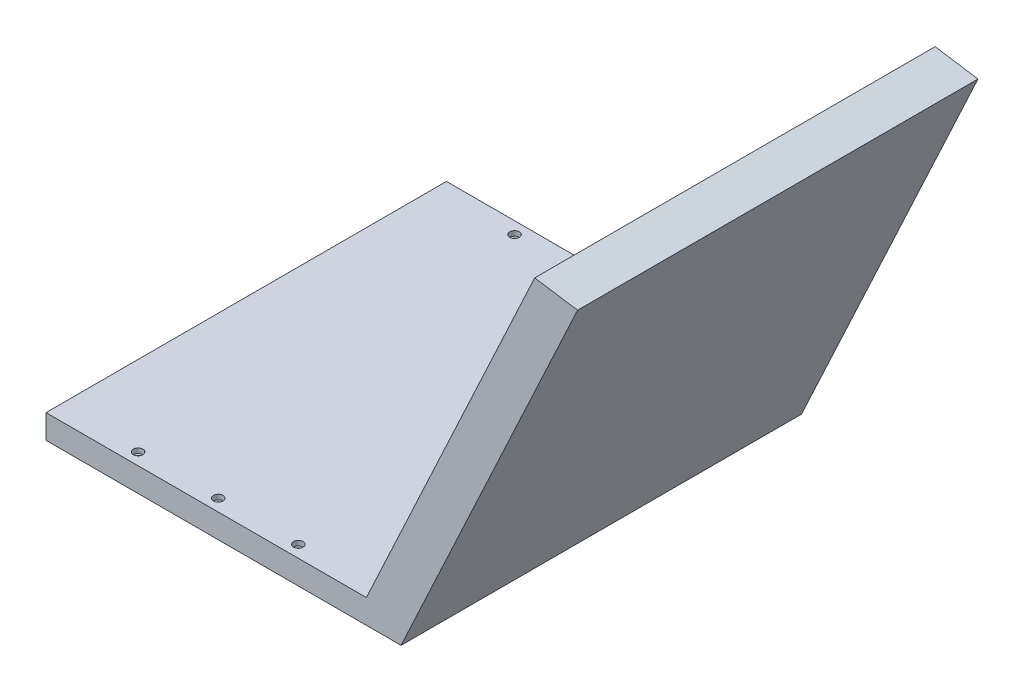
ISO-10303-21;
HEADER;
FILE_DESCRIPTION(('STEP AP214'),'2;1');
FILE_NAME('part.step','',(''),(''),'','','');
FILE_SCHEMA(('AUTOMOTIVE_DESIGN { 1 0 10303 214 1 1 1 1 }'));
ENDSEC;
DATA;
#1=APPLICATION_CONTEXT('core data for automotive mechanical design processes');
#2=APPLICATION_PROTOCOL_DEFINITION('international standard','automotive_design',2000,#1);
#3=PRODUCT_CONTEXT('',#1,'mechanical');
#4=PRODUCT('Part','Part','',(#3));
#5=PRODUCT_RELATED_PRODUCT_CATEGORY('part','',(#4));
#6=PRODUCT_DEFINITION_FORMATION('','',#4);
#7=PRODUCT_DEFINITION_CONTEXT('part definition',#1,'design');
#8=PRODUCT_DEFINITION('design','',#6,#7);
#9=PRODUCT_DEFINITION_SHAPE('','',#8);
#10=(LENGTH_UNIT() NAMED_UNIT(*) SI_UNIT(.MILLI.,.METRE.));
#11=(NAMED_UNIT(*) PLANE_ANGLE_UNIT() SI_UNIT($,.RADIAN.));
#12=(NAMED_UNIT(*) SI_UNIT($,.STERADIAN.) SOLID_ANGLE_UNIT());
#13=UNCERTAINTY_MEASURE_WITH_UNIT(LENGTH_MEASURE(1.E-05),#10,'distance_accuracy_value','');
#14=(GEOMETRIC_REPRESENTATION_CONTEXT(3) GLOBAL_UNCERTAINTY_ASSIGNED_CONTEXT((#13)) GLOBAL_UNIT_ASSIGNED_CONTEXT((#10,
#11,#12)) REPRESENTATION_CONTEXT('',''));
#15=CARTESIAN_POINT('',(0.,0.,0.));
#16=DIRECTION('',(0.,0.,1.));
#17=DIRECTION('',(1.,0.,0.));
#18=AXIS2_PLACEMENT_3D('',#15,#16,#17);
#19=CARTESIAN_POINT('',(0.,0.,250.));
#20=DIRECTION('',(-0.906307787036648,0.422618261740704,0.));
#21=DIRECTION('',(-0.422618261740704,-0.906307787036648,0.));
#22=AXIS2_PLACEMENT_3D('',#19,#20,#21);
#23=PLANE('',#22);
#24=DIRECTION('',(0.422618261740704,0.906307787036648,0.));
#25=VECTOR('',#24,1.);
#26=CARTESIAN_POINT('',(0.,0.,-250.));
#27=LINE('',#26,#25);
#28=CARTESIAN_POINT('',(0.,0.,-250.));
#29=VERTEX_POINT('',#28);
#30=CARTESIAN_POINT('',(220.358608676281,472.560561300136,-250.));
#31=VERTEX_POINT('',#30);
#32=EDGE_CURVE('E129',#29,#31,#27,.T.);
#33=ORIENTED_EDGE('',*,*,#32,.T.);
#34=DIRECTION('',(0.,0.,-1.));
#35=VECTOR('',#34,1.);
#36=CARTESIAN_POINT('',(220.358608676281,472.560561300136,250.));
#37=LINE('',#36,#35);
#38=CARTESIAN_POINT('',(220.358608676281,472.560561300136,250.));
#39=VERTEX_POINT('',#38);
#40=EDGE_CURVE('E11',#39,#31,#37,.T.);
#41=ORIENTED_EDGE('',*,*,#40,.F.);
#42=DIRECTION('',(0.422618261740704,0.906307787036648,0.));
#43=VECTOR('',#42,1.);
#44=CARTESIAN_POINT('',(0.,0.,250.));
#45=LINE('',#44,#43);
#46=CARTESIAN_POINT('',(0.,0.,250.));
#47=VERTEX_POINT('',#46);
#48=EDGE_CURVE('E140',#47,#39,#45,.T.);
#49=ORIENTED_EDGE('',*,*,#48,.F.);
#50=DIRECTION('',(0.,0.,-1.));
#51=VECTOR('',#50,1.);
#52=CARTESIAN_POINT('',(0.,0.,250.));
#53=LINE('',#52,#51);
#54=EDGE_CURVE('E125',#47,#29,#53,.T.);
#55=ORIENTED_EDGE('',*,*,#54,.T.);
#56=EDGE_LOOP('',(#33,#41,#49,#55));
#57=FACE_BOUND('',#56,.T.);
#58=ADVANCED_FACE('F45',(#57),#23,.F.);
#59=CARTESIAN_POINT('',(166.872551320847,480.821915027781,250.));
#60=DIRECTION('',(-0.152647929120268,-0.988280633087229,0.));
#61=DIRECTION('',(0.988280633087229,-0.152647929120268,0.));
#62=AXIS2_PLACEMENT_3D('',#59,#60,#61);
#63=PLANE('',#62);
#64=DIRECTION('',(-0.988280633087229,0.152647929120268,0.));
#65=VECTOR('',#64,1.);
#66=CARTESIAN_POINT('',(166.872551320847,480.821915027781,-250.));
#67=LINE('',#66,#65);
#68=CARTESIAN_POINT('',(166.872551320847,480.821915027781,-250.));
#69=VERTEX_POINT('',#68);
#70=EDGE_CURVE('E132',#31,#69,#67,.T.);
#71=ORIENTED_EDGE('',*,*,#70,.T.);
#72=DIRECTION('',(0.,0.,-1.));
#73=VECTOR('',#72,1.);
#74=CARTESIAN_POINT('',(166.872551320847,480.821915027781,250.));
#75=LINE('',#74,#73);
#76=CARTESIAN_POINT('',(166.872551320847,480.821915027781,250.));
#77=VERTEX_POINT('',#76);
#78=EDGE_CURVE('E53',#77,#69,#75,.T.);
#79=ORIENTED_EDGE('',*,*,#78,.F.);
#80=DIRECTION('',(-0.988280633087229,0.152647929120268,0.));
#81=VECTOR('',#80,1.);
#82=CARTESIAN_POINT('',(166.872551320847,480.821915027781,250.));
#83=LINE('',#82,#81);
#84=EDGE_CURVE('E98',#39,#77,#83,.T.);
#85=ORIENTED_EDGE('',*,*,#84,.F.);
#86=ORIENTED_EDGE('',*,*,#40,.T.);
#87=EDGE_LOOP('',(#71,#79,#85,#86));
#88=FACE_BOUND('',#87,.T.);
#89=ADVANCED_FACE('F169',(#88),#63,.F.);
#90=CARTESIAN_POINT('',(-43.3491601207117,30.,250.));
#91=DIRECTION('',(0.906307787036648,-0.422618261740703,0.));
#92=DIRECTION('',(0.422618261740703,0.906307787036648,0.));
#93=AXIS2_PLACEMENT_3D('',#90,#91,#92);
#94=PLANE('',#93);
#95=DIRECTION('',(-0.422618261740703,-0.906307787036648,0.));
#96=VECTOR('',#95,1.);
#97=CARTESIAN_POINT('',(-43.3491601207117,30.,-250.));
#98=LINE('',#97,#96);
#99=CARTESIAN_POINT('',(-43.3491601207117,30.,-250.));
#100=VERTEX_POINT('',#99);
#101=EDGE_CURVE('E135',#69,#100,#98,.T.);
#102=ORIENTED_EDGE('',*,*,#101,.T.);
#103=DIRECTION('',(0.,0.,-1.));
#104=VECTOR('',#103,1.);
#105=CARTESIAN_POINT('',(-43.3491601207117,30.,250.));
#106=LINE('',#105,#104);
#107=CARTESIAN_POINT('',(-43.3491601207117,30.,250.));
#108=VERTEX_POINT('',#107);
#109=EDGE_CURVE('E120',#108,#100,#106,.T.);
#110=ORIENTED_EDGE('',*,*,#109,.F.);
#111=DIRECTION('',(-0.422618261740703,-0.906307787036648,0.));
#112=VECTOR('',#111,1.);
#113=CARTESIAN_POINT('',(-43.3491601207117,30.,250.));
#114=LINE('',#113,#112);
#115=EDGE_CURVE('E111',#77,#108,#114,.T.);
#116=ORIENTED_EDGE('',*,*,#115,.F.);
#117=ORIENTED_EDGE('',*,*,#78,.T.);
#118=EDGE_LOOP('',(#102,#110,#116,#117));
#119=FACE_BOUND('',#118,.T.);
#120=ADVANCED_FACE('F146',(#119),#94,.F.);
#121=CARTESIAN_POINT('',(-443.349160120712,30.,250.));
#122=DIRECTION('',(0.,-1.,0.));
#123=DIRECTION('',(0.,0.,-1.));
#124=AXIS2_PLACEMENT_3D('',#121,#122,#123);
#125=PLANE('',#124);
#126=CARTESIAN_POINT('',(-343.349160120712,30.,-235.));
#127=DIRECTION('',(0.,1.,0.));
#128=DIRECTION('',(0.,0.,-1.));
#129=AXIS2_PLACEMENT_3D('',#126,#127,#128);
#130=CIRCLE('',#129,5.99999999999999);
#131=CARTESIAN_POINT('',(-343.349160120712,30.,-241.));
#132=VERTEX_POINT('',#131);
#133=EDGE_CURVE('E187',#132,#132,#130,.T.);
#134=ORIENTED_EDGE('',*,*,#133,.F.);
#135=EDGE_LOOP('',(#134));
#136=FACE_BOUND('',#135,.T.);
#137=CARTESIAN_POINT('',(-243.349160120712,30.,-235.));
#138=DIRECTION('',(0.,1.,0.));
#139=DIRECTION('',(0.,0.,-1.));
#140=AXIS2_PLACEMENT_3D('',#137,#138,#139);
#141=CIRCLE('',#140,6.00000000000002);
#142=CARTESIAN_POINT('',(-243.349160120712,30.,-241.));
#143=VERTEX_POINT('',#142);
#144=EDGE_CURVE('E191',#143,#143,#141,.T.);
#145=ORIENTED_EDGE('',*,*,#144,.F.);
#146=EDGE_LOOP('',(#145));
#147=FACE_BOUND('',#146,.T.);
#148=CARTESIAN_POINT('',(-143.349160120712,30.,-235.));
#149=DIRECTION('',(0.,1.,0.));
#150=DIRECTION('',(0.,0.,-1.));
#151=AXIS2_PLACEMENT_3D('',#148,#149,#150);
#152=CIRCLE('',#151,6.00000000000002);
#153=CARTESIAN_POINT('',(-143.349160120712,30.,-241.));
#154=VERTEX_POINT('',#153);
#155=EDGE_CURVE('E195',#154,#154,#152,.T.);
#156=ORIENTED_EDGE('',*,*,#155,.F.);
#157=EDGE_LOOP('',(#156));
#158=FACE_BOUND('',#157,.T.);
#159=CARTESIAN_POINT('',(-143.349160120712,30.,235.));
#160=DIRECTION('',(0.,1.,0.));
#161=DIRECTION('',(0.,0.,1.));
#162=AXIS2_PLACEMENT_3D('',#159,#160,#161);
#163=CIRCLE('',#162,6.00000000000002);
#164=CARTESIAN_POINT('',(-143.349160120712,30.,241.));
#165=VERTEX_POINT('',#164);
#166=EDGE_CURVE('E199',#165,#165,#163,.T.);
#167=ORIENTED_EDGE('',*,*,#166,.F.);
#168=EDGE_LOOP('',(#167));
#169=FACE_BOUND('',#168,.T.);
#170=CARTESIAN_POINT('',(-243.349160120712,30.,235.));
#171=DIRECTION('',(0.,1.,0.));
#172=DIRECTION('',(0.,0.,1.));
#173=AXIS2_PLACEMENT_3D('',#170,#171,#172);
#174=CIRCLE('',#173,6.00000000000002);
#175=CARTESIAN_POINT('',(-243.349160120712,30.,241.));
#176=VERTEX_POINT('',#175);
#177=EDGE_CURVE('E203',#176,#176,#174,.T.);
#178=ORIENTED_EDGE('',*,*,#177,.F.);
#179=EDGE_LOOP('',(#178));
#180=FACE_BOUND('',#179,.T.);
#181=CARTESIAN_POINT('',(-343.349160120712,30.,235.));
#182=DIRECTION('',(0.,1.,0.));
#183=DIRECTION('',(0.,0.,1.));
#184=AXIS2_PLACEMENT_3D('',#181,#182,#183);
#185=CIRCLE('',#184,5.99999999999999);
#186=CARTESIAN_POINT('',(-343.349160120712,30.,241.));
#187=VERTEX_POINT('',#186);
#188=EDGE_CURVE('E206',#187,#187,#185,.T.);
#189=ORIENTED_EDGE('',*,*,#188,.F.);
#190=EDGE_LOOP('',(#189));
#191=FACE_BOUND('',#190,.T.);
#192=DIRECTION('',(-1.,0.,0.));
#193=VECTOR('',#192,1.);
#194=CARTESIAN_POINT('',(-443.349160120712,30.,-250.));
#195=LINE('',#194,#193);
#196=CARTESIAN_POINT('',(-443.349160120712,30.,-250.));
#197=VERTEX_POINT('',#196);
#198=EDGE_CURVE('E119',#100,#197,#195,.T.);
#199=ORIENTED_EDGE('',*,*,#198,.T.);
#200=DIRECTION('',(0.,0.,-1.));
#201=VECTOR('',#200,1.);
#202=CARTESIAN_POINT('',(-443.349160120712,30.,250.));
#203=LINE('',#202,#201);
#204=CARTESIAN_POINT('',(-443.349160120712,30.,250.));
#205=VERTEX_POINT('',#204);
#206=EDGE_CURVE('E116',#205,#197,#203,.T.);
#207=ORIENTED_EDGE('',*,*,#206,.F.);
#208=DIRECTION('',(-1.,0.,0.));
#209=VECTOR('',#208,1.);
#210=CARTESIAN_POINT('',(-443.349160120712,30.,250.));
#211=LINE('',#210,#209);
#212=EDGE_CURVE('E105',#108,#205,#211,.T.);
#213=ORIENTED_EDGE('',*,*,#212,.F.);
#214=ORIENTED_EDGE('',*,*,#109,.T.);
#215=EDGE_LOOP('',(#199,#207,#213,#214));
#216=FACE_BOUND('',#215,.T.);
#217=ADVANCED_FACE('F117',(#136,#147,#158,#169,#180,#191,#216),#125,.F.);
#218=CARTESIAN_POINT('',(-443.349160120712,30.,250.));
#219=DIRECTION('',(1.,0.,0.));
#220=DIRECTION('',(0.,0.,-1.));
#221=AXIS2_PLACEMENT_3D('',#218,#219,#220);
#222=PLANE('',#221);
#223=DIRECTION('',(0.,-1.,0.));
#224=VECTOR('',#223,1.);
#225=CARTESIAN_POINT('',(-443.349160120712,30.,-250.));
#226=LINE('',#225,#224);
#227=CARTESIAN_POINT('',(-443.349160120712,0.,-250.));
#228=VERTEX_POINT('',#227);
#229=EDGE_CURVE('E84',#197,#228,#226,.T.);
#230=ORIENTED_EDGE('',*,*,#229,.T.);
#231=DIRECTION('',(0.,0.,-1.));
#232=VECTOR('',#231,1.);
#233=CARTESIAN_POINT('',(-443.349160120712,0.,250.));
#234=LINE('',#233,#232);
#235=CARTESIAN_POINT('',(-443.349160120712,0.,250.));
#236=VERTEX_POINT('',#235);
#237=EDGE_CURVE('E121',#236,#228,#234,.T.);
#238=ORIENTED_EDGE('',*,*,#237,.F.);
#239=DIRECTION('',(0.,-1.,0.));
#240=VECTOR('',#239,1.);
#241=CARTESIAN_POINT('',(-443.349160120712,30.,250.));
#242=LINE('',#241,#240);
#243=EDGE_CURVE('E109',#205,#236,#242,.T.);
#244=ORIENTED_EDGE('',*,*,#243,.F.);
#245=ORIENTED_EDGE('',*,*,#206,.T.);
#246=EDGE_LOOP('',(#230,#238,#244,#245));
#247=FACE_BOUND('',#246,.T.);
#248=ADVANCED_FACE('F123',(#247),#222,.F.);
#249=CARTESIAN_POINT('',(0.,0.,250.));
#250=DIRECTION('',(0.,1.,0.));
#251=DIRECTION('',(-1.,0.,0.));
#252=AXIS2_PLACEMENT_3D('',#249,#250,#251);
#253=PLANE('',#252);
#254=CARTESIAN_POINT('',(-143.349160120712,0.,235.));
#255=DIRECTION('',(0.,1.,0.));
#256=DIRECTION('',(0.,0.,1.));
#257=AXIS2_PLACEMENT_3D('',#254,#255,#256);
#258=CIRCLE('',#257,2.99999999999999);
#259=CARTESIAN_POINT('',(-143.349160120712,0.,238.));
#260=VERTEX_POINT('',#259);
#261=EDGE_CURVE('E241',#260,#260,#258,.T.);
#262=ORIENTED_EDGE('',*,*,#261,.T.);
#263=EDGE_LOOP('',(#262));
#264=FACE_BOUND('',#263,.T.);
#265=CARTESIAN_POINT('',(-343.349160120712,0.,235.));
#266=DIRECTION('',(0.,1.,0.));
#267=DIRECTION('',(0.,0.,1.));
#268=AXIS2_PLACEMENT_3D('',#265,#266,#267);
#269=CIRCLE('',#268,2.99999999999999);
#270=CARTESIAN_POINT('',(-343.349160120712,0.,238.));
#271=VERTEX_POINT('',#270);
#272=EDGE_CURVE('E254',#271,#271,#269,.T.);
#273=ORIENTED_EDGE('',*,*,#272,.T.);
#274=EDGE_LOOP('',(#273));
#275=FACE_BOUND('',#274,.T.);
#276=CARTESIAN_POINT('',(-243.349160120712,0.,-234.999999999999));
#277=DIRECTION('',(0.,1.,0.));
#278=DIRECTION('',(0.,0.,1.));
#279=AXIS2_PLACEMENT_3D('',#276,#277,#278);
#280=CIRCLE('',#279,2.99999999999999);
#281=CARTESIAN_POINT('',(-243.349160120712,0.,-231.999999999999));
#282=VERTEX_POINT('',#281);
#283=EDGE_CURVE('E247',#282,#282,#280,.T.);
#284=ORIENTED_EDGE('',*,*,#283,.T.);
#285=EDGE_LOOP('',(#284));
#286=FACE_BOUND('',#285,.T.);
#287=CARTESIAN_POINT('',(-343.349160120712,0.,-234.999999999999));
#288=DIRECTION('',(0.,1.,0.));
#289=DIRECTION('',(0.,0.,1.));
#290=AXIS2_PLACEMENT_3D('',#287,#288,#289);
#291=CIRCLE('',#290,2.99999999999993);
#292=CARTESIAN_POINT('',(-343.349160120712,0.,-231.999999999999));
#293=VERTEX_POINT('',#292);
#294=EDGE_CURVE('E264',#293,#293,#291,.T.);
#295=ORIENTED_EDGE('',*,*,#294,.T.);
#296=EDGE_LOOP('',(#295));
#297=FACE_BOUND('',#296,.T.);
#298=CARTESIAN_POINT('',(-243.349160120712,0.,235.));
#299=DIRECTION('',(0.,1.,0.));
#300=DIRECTION('',(0.,0.,1.));
#301=AXIS2_PLACEMENT_3D('',#298,#299,#300);
#302=CIRCLE('',#301,2.99999999999999);
#303=CARTESIAN_POINT('',(-243.349160120712,0.,238.));
#304=VERTEX_POINT('',#303);
#305=EDGE_CURVE('E246',#304,#304,#302,.T.);
#306=ORIENTED_EDGE('',*,*,#305,.T.);
#307=EDGE_LOOP('',(#306));
#308=FACE_BOUND('',#307,.T.);
#309=CARTESIAN_POINT('',(-143.349160120712,0.,-235.));
#310=DIRECTION('',(0.,1.,0.));
#311=DIRECTION('',(0.,0.,1.));
#312=AXIS2_PLACEMENT_3D('',#309,#310,#311);
#313=CIRCLE('',#312,2.99999999999999);
#314=CARTESIAN_POINT('',(-143.349160120712,0.,-232.));
#315=VERTEX_POINT('',#314);
#316=EDGE_CURVE('E219',#315,#315,#313,.T.);
#317=ORIENTED_EDGE('',*,*,#316,.T.);
#318=EDGE_LOOP('',(#317));
#319=FACE_BOUND('',#318,.T.);
#320=DIRECTION('',(1.,0.,0.));
#321=VECTOR('',#320,1.);
#322=CARTESIAN_POINT('',(0.,0.,-250.));
#323=LINE('',#322,#321);
#324=EDGE_CURVE('E90',#228,#29,#323,.T.);
#325=ORIENTED_EDGE('',*,*,#324,.T.);
#326=ORIENTED_EDGE('',*,*,#54,.F.);
#327=DIRECTION('',(1.,0.,0.));
#328=VECTOR('',#327,1.);
#329=CARTESIAN_POINT('',(0.,0.,250.));
#330=LINE('',#329,#328);
#331=EDGE_CURVE('E61',#236,#47,#330,.T.);
#332=ORIENTED_EDGE('',*,*,#331,.F.);
#333=ORIENTED_EDGE('',*,*,#237,.T.);
#334=EDGE_LOOP('',(#325,#326,#332,#333));
#335=FACE_BOUND('',#334,.T.);
#336=ADVANCED_FACE('F153',(#264,#275,#286,#297,#308,#319,#335),#253,.F.);
#337=CARTESIAN_POINT('',(0.,0.,250.));
#338=DIRECTION('',(0.,0.,-1.));
#339=DIRECTION('',(-1.,0.,0.));
#340=AXIS2_PLACEMENT_3D('',#337,#338,#339);
#341=PLANE('',#340);
#342=ORIENTED_EDGE('',*,*,#48,.T.);
#343=ORIENTED_EDGE('',*,*,#84,.T.);
#344=ORIENTED_EDGE('',*,*,#115,.T.);
#345=ORIENTED_EDGE('',*,*,#212,.T.);
#346=ORIENTED_EDGE('',*,*,#243,.T.);
#347=ORIENTED_EDGE('',*,*,#331,.T.);
#348=EDGE_LOOP('',(#342,#343,#344,#345,#346,#347));
#349=FACE_BOUND('',#348,.T.);
#350=ADVANCED_FACE('F107',(#349),#341,.F.);
#351=CARTESIAN_POINT('',(0.,0.,-250.));
#352=DIRECTION('',(0.,0.,-1.));
#353=DIRECTION('',(-1.,0.,0.));
#354=AXIS2_PLACEMENT_3D('',#351,#352,#353);
#355=PLANE('',#354);
#356=ORIENTED_EDGE('',*,*,#32,.F.);
#357=ORIENTED_EDGE('',*,*,#324,.F.);
#358=ORIENTED_EDGE('',*,*,#229,.F.);
#359=ORIENTED_EDGE('',*,*,#198,.F.);
#360=ORIENTED_EDGE('',*,*,#101,.F.);
#361=ORIENTED_EDGE('',*,*,#70,.F.);
#362=EDGE_LOOP('',(#356,#357,#358,#359,#360,#361));
#363=FACE_BOUND('',#362,.T.);
#364=ADVANCED_FACE('F149',(#363),#355,.T.);
#365=CARTESIAN_POINT('',(-343.349160120712,24.,235.));
#366=DIRECTION('',(0.,1.,0.));
#367=DIRECTION('',(0.,0.,1.));
#368=AXIS2_PLACEMENT_3D('',#365,#366,#367);
#369=CYLINDRICAL_SURFACE('',#368,5.99999999999999);
#370=CARTESIAN_POINT('',(-343.349160120712,24.,235.));
#371=DIRECTION('',(0.,1.,0.));
#372=DIRECTION('',(0.,0.,1.));
#373=AXIS2_PLACEMENT_3D('',#370,#371,#372);
#374=CIRCLE('',#373,5.99999999999999);
#375=CARTESIAN_POINT('',(-343.349160120712,24.,241.));
#376=VERTEX_POINT('',#375);
#377=EDGE_CURVE('E133',#376,#376,#374,.T.);
#378=ORIENTED_EDGE('',*,*,#377,.F.);
#379=EDGE_LOOP('',(#378));
#380=FACE_BOUND('',#379,.T.);
#381=ORIENTED_EDGE('',*,*,#188,.T.);
#382=EDGE_LOOP('',(#381));
#383=FACE_BOUND('',#382,.T.);
#384=ADVANCED_FACE('F295',(#380,#383),#369,.F.);
#385=CARTESIAN_POINT('',(-343.349160120712,24.,235.));
#386=DIRECTION('',(0.,1.,0.));
#387=DIRECTION('',(0.,0.,1.));
#388=AXIS2_PLACEMENT_3D('',#385,#386,#387);
#389=PLANE('',#388);
#390=CARTESIAN_POINT('',(-343.349160120712,24.,235.));
#391=DIRECTION('',(0.,1.,0.));
#392=DIRECTION('',(0.,0.,1.));
#393=AXIS2_PLACEMENT_3D('',#390,#391,#392);
#394=CIRCLE('',#393,2.99999999999999);
#395=CARTESIAN_POINT('',(-343.349160120712,24.,238.));
#396=VERTEX_POINT('',#395);
#397=EDGE_CURVE('E238',#396,#396,#394,.T.);
#398=ORIENTED_EDGE('',*,*,#397,.F.);
#399=EDGE_LOOP('',(#398));
#400=FACE_BOUND('',#399,.T.);
#401=ORIENTED_EDGE('',*,*,#377,.T.);
#402=EDGE_LOOP('',(#401));
#403=FACE_BOUND('',#402,.T.);
#404=ADVANCED_FACE('F292',(#400,#403),#389,.T.);
#405=CARTESIAN_POINT('',(-243.349160120712,24.,235.));
#406=DIRECTION('',(0.,1.,0.));
#407=DIRECTION('',(0.,0.,1.));
#408=AXIS2_PLACEMENT_3D('',#405,#406,#407);
#409=CYLINDRICAL_SURFACE('',#408,6.00000000000002);
#410=CARTESIAN_POINT('',(-243.349160120712,24.,235.));
#411=DIRECTION('',(0.,1.,0.));
#412=DIRECTION('',(0.,0.,1.));
#413=AXIS2_PLACEMENT_3D('',#410,#411,#412);
#414=CIRCLE('',#413,6.00000000000002);
#415=CARTESIAN_POINT('',(-243.349160120712,24.,241.));
#416=VERTEX_POINT('',#415);
#417=EDGE_CURVE('E211',#416,#416,#414,.T.);
#418=ORIENTED_EDGE('',*,*,#417,.F.);
#419=EDGE_LOOP('',(#418));
#420=FACE_BOUND('',#419,.T.);
#421=ORIENTED_EDGE('',*,*,#177,.T.);
#422=EDGE_LOOP('',(#421));
#423=FACE_BOUND('',#422,.T.);
#424=ADVANCED_FACE('F294',(#420,#423),#409,.F.);
#425=CARTESIAN_POINT('',(-243.349160120712,24.,235.));
#426=DIRECTION('',(0.,1.,0.));
#427=DIRECTION('',(0.,0.,1.));
#428=AXIS2_PLACEMENT_3D('',#425,#426,#427);
#429=PLANE('',#428);
#430=CARTESIAN_POINT('',(-243.349160120712,24.,235.));
#431=DIRECTION('',(0.,1.,0.));
#432=DIRECTION('',(0.,0.,1.));
#433=AXIS2_PLACEMENT_3D('',#430,#431,#432);
#434=CIRCLE('',#433,2.99999999999999);
#435=CARTESIAN_POINT('',(-243.349160120712,24.,238.));
#436=VERTEX_POINT('',#435);
#437=EDGE_CURVE('E261',#436,#436,#434,.T.);
#438=ORIENTED_EDGE('',*,*,#437,.F.);
#439=EDGE_LOOP('',(#438));
#440=FACE_BOUND('',#439,.T.);
#441=ORIENTED_EDGE('',*,*,#417,.T.);
#442=EDGE_LOOP('',(#441));
#443=FACE_BOUND('',#442,.T.);
#444=ADVANCED_FACE('F348',(#440,#443),#429,.T.);
#445=CARTESIAN_POINT('',(-143.349160120712,24.,235.));
#446=DIRECTION('',(0.,1.,0.));
#447=DIRECTION('',(0.,0.,1.));
#448=AXIS2_PLACEMENT_3D('',#445,#446,#447);
#449=CYLINDRICAL_SURFACE('',#448,6.00000000000002);
#450=CARTESIAN_POINT('',(-143.349160120712,24.,235.));
#451=DIRECTION('',(0.,1.,0.));
#452=DIRECTION('',(0.,0.,1.));
#453=AXIS2_PLACEMENT_3D('',#450,#451,#452);
#454=CIRCLE('',#453,6.00000000000002);
#455=CARTESIAN_POINT('',(-143.349160120712,24.,241.));
#456=VERTEX_POINT('',#455);
#457=EDGE_CURVE('E229',#456,#456,#454,.T.);
#458=ORIENTED_EDGE('',*,*,#457,.F.);
#459=EDGE_LOOP('',(#458));
#460=FACE_BOUND('',#459,.T.);
#461=ORIENTED_EDGE('',*,*,#166,.T.);
#462=EDGE_LOOP('',(#461));
#463=FACE_BOUND('',#462,.T.);
#464=ADVANCED_FACE('F357',(#460,#463),#449,.F.);
#465=CARTESIAN_POINT('',(-143.349160120712,24.,235.));
#466=DIRECTION('',(0.,1.,0.));
#467=DIRECTION('',(0.,0.,1.));
#468=AXIS2_PLACEMENT_3D('',#465,#466,#467);
#469=PLANE('',#468);
#470=CARTESIAN_POINT('',(-143.349160120712,24.,235.));
#471=DIRECTION('',(0.,1.,0.));
#472=DIRECTION('',(0.,0.,1.));
#473=AXIS2_PLACEMENT_3D('',#470,#471,#472);
#474=CIRCLE('',#473,2.99999999999999);
#475=CARTESIAN_POINT('',(-143.349160120712,24.,238.));
#476=VERTEX_POINT('',#475);
#477=EDGE_CURVE('E243',#476,#476,#474,.T.);
#478=ORIENTED_EDGE('',*,*,#477,.F.);
#479=EDGE_LOOP('',(#478));
#480=FACE_BOUND('',#479,.T.);
#481=ORIENTED_EDGE('',*,*,#457,.T.);
#482=EDGE_LOOP('',(#481));
#483=FACE_BOUND('',#482,.T.);
#484=ADVANCED_FACE('F366',(#480,#483),#469,.T.);
#485=CARTESIAN_POINT('',(-143.349160120712,24.,-235.));
#486=DIRECTION('',(0.,1.,0.));
#487=DIRECTION('',(0.,0.,1.));
#488=AXIS2_PLACEMENT_3D('',#485,#486,#487);
#489=CYLINDRICAL_SURFACE('',#488,6.00000000000002);
#490=CARTESIAN_POINT('',(-143.349160120712,24.,-235.));
#491=DIRECTION('',(0.,1.,0.));
#492=DIRECTION('',(0.,0.,-1.));
#493=AXIS2_PLACEMENT_3D('',#490,#491,#492);
#494=CIRCLE('',#493,6.00000000000002);
#495=CARTESIAN_POINT('',(-143.349160120712,24.,-241.));
#496=VERTEX_POINT('',#495);
#497=EDGE_CURVE('E225',#496,#496,#494,.T.);
#498=ORIENTED_EDGE('',*,*,#497,.F.);
#499=EDGE_LOOP('',(#498));
#500=FACE_BOUND('',#499,.T.);
#501=ORIENTED_EDGE('',*,*,#155,.T.);
#502=EDGE_LOOP('',(#501));
#503=FACE_BOUND('',#502,.T.);
#504=ADVANCED_FACE('F375',(#500,#503),#489,.F.);
#505=CARTESIAN_POINT('',(-143.349160120712,24.,-235.));
#506=DIRECTION('',(0.,-1.,0.));
#507=DIRECTION('',(0.,0.,-1.));
#508=AXIS2_PLACEMENT_3D('',#505,#506,#507);
#509=PLANE('',#508);
#510=CARTESIAN_POINT('',(-143.349160120712,24.,-235.));
#511=DIRECTION('',(0.,1.,0.));
#512=DIRECTION('',(0.,0.,1.));
#513=AXIS2_PLACEMENT_3D('',#510,#511,#512);
#514=CIRCLE('',#513,2.99999999999999);
#515=CARTESIAN_POINT('',(-143.349160120712,24.,-232.));
#516=VERTEX_POINT('',#515);
#517=EDGE_CURVE('E235',#516,#516,#514,.T.);
#518=ORIENTED_EDGE('',*,*,#517,.F.);
#519=EDGE_LOOP('',(#518));
#520=FACE_BOUND('',#519,.T.);
#521=ORIENTED_EDGE('',*,*,#497,.T.);
#522=EDGE_LOOP('',(#521));
#523=FACE_BOUND('',#522,.T.);
#524=ADVANCED_FACE('F384',(#520,#523),#509,.F.);
#525=CARTESIAN_POINT('',(-243.349160120712,24.,-235.));
#526=DIRECTION('',(0.,1.,0.));
#527=DIRECTION('',(0.,0.,1.));
#528=AXIS2_PLACEMENT_3D('',#525,#526,#527);
#529=CYLINDRICAL_SURFACE('',#528,6.00000000000002);
#530=CARTESIAN_POINT('',(-243.349160120712,24.,-235.));
#531=DIRECTION('',(0.,1.,0.));
#532=DIRECTION('',(0.,0.,-1.));
#533=AXIS2_PLACEMENT_3D('',#530,#531,#532);
#534=CIRCLE('',#533,6.00000000000002);
#535=CARTESIAN_POINT('',(-243.349160120712,24.,-241.));
#536=VERTEX_POINT('',#535);
#537=EDGE_CURVE('E221',#536,#536,#534,.T.);
#538=ORIENTED_EDGE('',*,*,#537,.F.);
#539=EDGE_LOOP('',(#538));
#540=FACE_BOUND('',#539,.T.);
#541=ORIENTED_EDGE('',*,*,#144,.T.);
#542=EDGE_LOOP('',(#541));
#543=FACE_BOUND('',#542,.T.);
#544=ADVANCED_FACE('F287',(#540,#543),#529,.F.);
#545=CARTESIAN_POINT('',(-243.349160120712,24.,-235.));
#546=DIRECTION('',(0.,-1.,0.));
#547=DIRECTION('',(0.,0.,-1.));
#548=AXIS2_PLACEMENT_3D('',#545,#546,#547);
#549=PLANE('',#548);
#550=CARTESIAN_POINT('',(-243.349160120712,24.,-234.999999999999));
#551=DIRECTION('',(0.,1.,0.));
#552=DIRECTION('',(0.,0.,1.));
#553=AXIS2_PLACEMENT_3D('',#550,#551,#552);
#554=CIRCLE('',#553,2.99999999999999);
#555=CARTESIAN_POINT('',(-243.349160120712,24.,-231.999999999999));
#556=VERTEX_POINT('',#555);
#557=EDGE_CURVE('E250',#556,#556,#554,.T.);
#558=ORIENTED_EDGE('',*,*,#557,.F.);
#559=EDGE_LOOP('',(#558));
#560=FACE_BOUND('',#559,.T.);
#561=ORIENTED_EDGE('',*,*,#537,.T.);
#562=EDGE_LOOP('',(#561));
#563=FACE_BOUND('',#562,.T.);
#564=ADVANCED_FACE('F281',(#560,#563),#549,.F.);
#565=CARTESIAN_POINT('',(-343.349160120712,24.,-235.));
#566=DIRECTION('',(0.,1.,0.));
#567=DIRECTION('',(0.,0.,1.));
#568=AXIS2_PLACEMENT_3D('',#565,#566,#567);
#569=CYLINDRICAL_SURFACE('',#568,5.99999999999999);
#570=CARTESIAN_POINT('',(-343.349160120712,24.,-235.));
#571=DIRECTION('',(0.,1.,0.));
#572=DIRECTION('',(0.,0.,-1.));
#573=AXIS2_PLACEMENT_3D('',#570,#571,#572);
#574=CIRCLE('',#573,5.99999999999999);
#575=CARTESIAN_POINT('',(-343.349160120712,24.,-241.));
#576=VERTEX_POINT('',#575);
#577=EDGE_CURVE('E216',#576,#576,#574,.T.);
#578=ORIENTED_EDGE('',*,*,#577,.F.);
#579=EDGE_LOOP('',(#578));
#580=FACE_BOUND('',#579,.T.);
#581=ORIENTED_EDGE('',*,*,#133,.T.);
#582=EDGE_LOOP('',(#581));
#583=FACE_BOUND('',#582,.T.);
#584=ADVANCED_FACE('F276',(#580,#583),#569,.F.);
#585=CARTESIAN_POINT('',(-343.349160120712,24.,-235.));
#586=DIRECTION('',(0.,-1.,0.));
#587=DIRECTION('',(0.,0.,-1.));
#588=AXIS2_PLACEMENT_3D('',#585,#586,#587);
#589=PLANE('',#588);
#590=CARTESIAN_POINT('',(-343.349160120712,24.,-234.999999999999));
#591=DIRECTION('',(0.,1.,0.));
#592=DIRECTION('',(0.,0.,1.));
#593=AXIS2_PLACEMENT_3D('',#590,#591,#592);
#594=CIRCLE('',#593,2.99999999999993);
#595=CARTESIAN_POINT('',(-343.349160120712,24.,-231.999999999999));
#596=VERTEX_POINT('',#595);
#597=EDGE_CURVE('E251',#596,#596,#594,.T.);
#598=ORIENTED_EDGE('',*,*,#597,.F.);
#599=EDGE_LOOP('',(#598));
#600=FACE_BOUND('',#599,.T.);
#601=ORIENTED_EDGE('',*,*,#577,.T.);
#602=EDGE_LOOP('',(#601));
#603=FACE_BOUND('',#602,.T.);
#604=ADVANCED_FACE('F272',(#600,#603),#589,.F.);
#605=CARTESIAN_POINT('',(-143.349160120712,0.,-235.));
#606=DIRECTION('',(0.,1.,0.));
#607=DIRECTION('',(0.,0.,1.));
#608=AXIS2_PLACEMENT_3D('',#605,#606,#607);
#609=CYLINDRICAL_SURFACE('',#608,2.99999999999999);
#610=ORIENTED_EDGE('',*,*,#316,.F.);
#611=EDGE_LOOP('',(#610));
#612=FACE_BOUND('',#611,.T.);
#613=ORIENTED_EDGE('',*,*,#517,.T.);
#614=EDGE_LOOP('',(#613));
#615=FACE_BOUND('',#614,.T.);
#616=ADVANCED_FACE('F275',(#612,#615),#609,.F.);
#617=CARTESIAN_POINT('',(-243.349160120712,0.,235.));
#618=DIRECTION('',(0.,1.,0.));
#619=DIRECTION('',(0.,0.,1.));
#620=AXIS2_PLACEMENT_3D('',#617,#618,#619);
#621=CYLINDRICAL_SURFACE('',#620,2.99999999999999);
#622=ORIENTED_EDGE('',*,*,#305,.F.);
#623=EDGE_LOOP('',(#622));
#624=FACE_BOUND('',#623,.T.);
#625=ORIENTED_EDGE('',*,*,#437,.T.);
#626=EDGE_LOOP('',(#625));
#627=FACE_BOUND('',#626,.T.);
#628=ADVANCED_FACE('F421',(#624,#627),#621,.F.);
#629=CARTESIAN_POINT('',(-343.349160120712,0.,-234.999999999999));
#630=DIRECTION('',(0.,1.,0.));
#631=DIRECTION('',(0.,0.,1.));
#632=AXIS2_PLACEMENT_3D('',#629,#630,#631);
#633=CYLINDRICAL_SURFACE('',#632,2.99999999999993);
#634=ORIENTED_EDGE('',*,*,#294,.F.);
#635=EDGE_LOOP('',(#634));
#636=FACE_BOUND('',#635,.T.);
#637=ORIENTED_EDGE('',*,*,#597,.T.);
#638=EDGE_LOOP('',(#637));
#639=FACE_BOUND('',#638,.T.);
#640=ADVANCED_FACE('F270',(#636,#639),#633,.F.);
#641=CARTESIAN_POINT('',(-243.349160120712,0.,-234.999999999999));
#642=DIRECTION('',(0.,1.,0.));
#643=DIRECTION('',(0.,0.,1.));
#644=AXIS2_PLACEMENT_3D('',#641,#642,#643);
#645=CYLINDRICAL_SURFACE('',#644,2.99999999999999);
#646=ORIENTED_EDGE('',*,*,#283,.F.);
#647=EDGE_LOOP('',(#646));
#648=FACE_BOUND('',#647,.T.);
#649=ORIENTED_EDGE('',*,*,#557,.T.);
#650=EDGE_LOOP('',(#649));
#651=FACE_BOUND('',#650,.T.);
#652=ADVANCED_FACE('F438',(#648,#651),#645,.F.);
#653=CARTESIAN_POINT('',(-343.349160120712,0.,235.));
#654=DIRECTION('',(0.,1.,0.));
#655=DIRECTION('',(0.,0.,1.));
#656=AXIS2_PLACEMENT_3D('',#653,#654,#655);
#657=CYLINDRICAL_SURFACE('',#656,2.99999999999999);
#658=ORIENTED_EDGE('',*,*,#272,.F.);
#659=EDGE_LOOP('',(#658));
#660=FACE_BOUND('',#659,.T.);
#661=ORIENTED_EDGE('',*,*,#397,.T.);
#662=EDGE_LOOP('',(#661));
#663=FACE_BOUND('',#662,.T.);
#664=ADVANCED_FACE('F447',(#660,#663),#657,.F.);
#665=CARTESIAN_POINT('',(-143.349160120712,0.,235.));
#666=DIRECTION('',(0.,1.,0.));
#667=DIRECTION('',(0.,0.,1.));
#668=AXIS2_PLACEMENT_3D('',#665,#666,#667);
#669=CYLINDRICAL_SURFACE('',#668,2.99999999999999);
#670=ORIENTED_EDGE('',*,*,#261,.F.);
#671=EDGE_LOOP('',(#670));
#672=FACE_BOUND('',#671,.T.);
#673=ORIENTED_EDGE('',*,*,#477,.T.);
#674=EDGE_LOOP('',(#673));
#675=FACE_BOUND('',#674,.T.);
#676=ADVANCED_FACE('F456',(#672,#675),#669,.F.);
#677=CLOSED_SHELL('',(#58,#89,#120,#217,#248,#336,#350,#364,#384,#404,#424,#444,#464,#484,#504,
#524,#544,#564,#584,#604,#616,#628,#640,#652,#664,#676));
#678=MANIFOLD_SOLID_BREP('B2',#677);
#679=ADVANCED_BREP_SHAPE_REPRESENTATION('',(#18,#678),#14);
#680=SHAPE_DEFINITION_REPRESENTATION(#9,#679);
ENDSEC;
END-ISO-10303-21;
